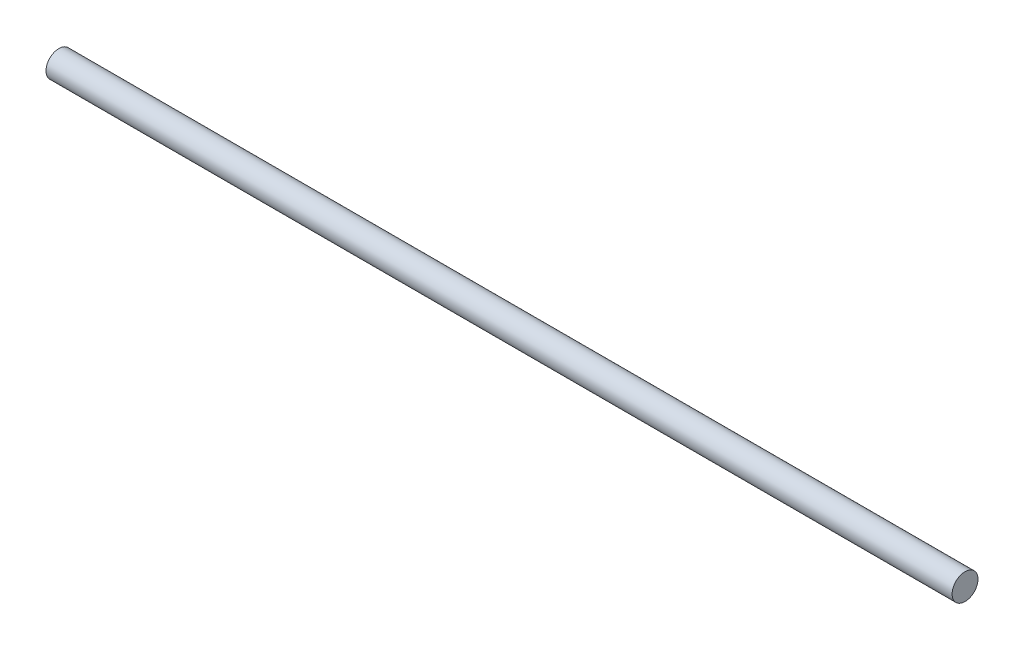
ISO-10303-21;
HEADER;
FILE_DESCRIPTION(('STEP AP214'),'2;1');
FILE_NAME('part.step','',(''),(''),'','','');
FILE_SCHEMA(('AUTOMOTIVE_DESIGN { 1 0 10303 214 1 1 1 1 }'));
ENDSEC;
DATA;
#1=APPLICATION_CONTEXT('core data for automotive mechanical design processes');
#2=APPLICATION_PROTOCOL_DEFINITION('international standard','automotive_design',2000,#1);
#3=PRODUCT_CONTEXT('',#1,'mechanical');
#4=PRODUCT('Part','Part','',(#3));
#5=PRODUCT_RELATED_PRODUCT_CATEGORY('part','',(#4));
#6=PRODUCT_DEFINITION_FORMATION('','',#4);
#7=PRODUCT_DEFINITION_CONTEXT('part definition',#1,'design');
#8=PRODUCT_DEFINITION('design','',#6,#7);
#9=PRODUCT_DEFINITION_SHAPE('','',#8);
#10=(LENGTH_UNIT() NAMED_UNIT(*) SI_UNIT(.MILLI.,.METRE.));
#11=(NAMED_UNIT(*) PLANE_ANGLE_UNIT() SI_UNIT($,.RADIAN.));
#12=(NAMED_UNIT(*) SI_UNIT($,.STERADIAN.) SOLID_ANGLE_UNIT());
#13=UNCERTAINTY_MEASURE_WITH_UNIT(LENGTH_MEASURE(1.E-05),#10,'distance_accuracy_value','');
#14=(GEOMETRIC_REPRESENTATION_CONTEXT(3) GLOBAL_UNCERTAINTY_ASSIGNED_CONTEXT((#13)) GLOBAL_UNIT_ASSIGNED_CONTEXT((#10,
#11,#12)) REPRESENTATION_CONTEXT('',''));
#15=CARTESIAN_POINT('',(0.,0.,0.));
#16=DIRECTION('',(0.,0.,1.));
#17=DIRECTION('',(1.,0.,0.));
#18=AXIS2_PLACEMENT_3D('',#15,#16,#17);
#19=CARTESIAN_POINT('',(35.,0.,0.));
#20=DIRECTION('',(-1.,0.,0.));
#21=DIRECTION('',(0.,0.,1.));
#22=AXIS2_PLACEMENT_3D('',#19,#20,#21);
#23=CYLINDRICAL_SURFACE('',#22,0.999999999999999);
#24=CARTESIAN_POINT('',(35.,0.,0.));
#25=DIRECTION('',(1.,0.,0.));
#26=DIRECTION('',(0.,0.,-1.));
#27=AXIS2_PLACEMENT_3D('',#24,#25,#26);
#28=CIRCLE('',#27,0.999999999999999);
#29=CARTESIAN_POINT('',(35.,0.,-0.999999999999999));
#30=VERTEX_POINT('',#29);
#31=EDGE_CURVE('E10',#30,#30,#28,.T.);
#32=ORIENTED_EDGE('',*,*,#31,.F.);
#33=EDGE_LOOP('',(#32));
#34=FACE_BOUND('',#33,.T.);
#35=CARTESIAN_POINT('',(-35.,0.,0.));
#36=DIRECTION('',(1.,0.,0.));
#37=DIRECTION('',(0.,0.,-1.));
#38=AXIS2_PLACEMENT_3D('',#35,#36,#37);
#39=CIRCLE('',#38,0.999999999999999);
#40=CARTESIAN_POINT('',(-35.,0.,-0.999999999999999));
#41=VERTEX_POINT('',#40);
#42=EDGE_CURVE('E34',#41,#41,#39,.T.);
#43=ORIENTED_EDGE('',*,*,#42,.T.);
#44=EDGE_LOOP('',(#43));
#45=FACE_BOUND('',#44,.T.);
#46=ADVANCED_FACE('F31',(#34,#45),#23,.T.);
#47=CARTESIAN_POINT('',(35.,0.,0.));
#48=DIRECTION('',(1.,0.,0.));
#49=DIRECTION('',(0.,0.,-1.));
#50=AXIS2_PLACEMENT_3D('',#47,#48,#49);
#51=PLANE('',#50);
#52=ORIENTED_EDGE('',*,*,#31,.T.);
#53=EDGE_LOOP('',(#52));
#54=FACE_BOUND('',#53,.T.);
#55=ADVANCED_FACE('F46',(#54),#51,.T.);
#56=CARTESIAN_POINT('',(-35.,0.,0.));
#57=DIRECTION('',(1.,0.,0.));
#58=DIRECTION('',(0.,0.,-1.));
#59=AXIS2_PLACEMENT_3D('',#56,#57,#58);
#60=PLANE('',#59);
#61=ORIENTED_EDGE('',*,*,#42,.F.);
#62=EDGE_LOOP('',(#61));
#63=FACE_BOUND('',#62,.T.);
#64=ADVANCED_FACE('F44',(#63),#60,.F.);
#65=CLOSED_SHELL('',(#46,#55,#64));
#66=MANIFOLD_SOLID_BREP('B2',#65);
#67=ADVANCED_BREP_SHAPE_REPRESENTATION('',(#18,#66),#14);
#68=SHAPE_DEFINITION_REPRESENTATION(#9,#67);
ENDSEC;
END-ISO-10303-21;
